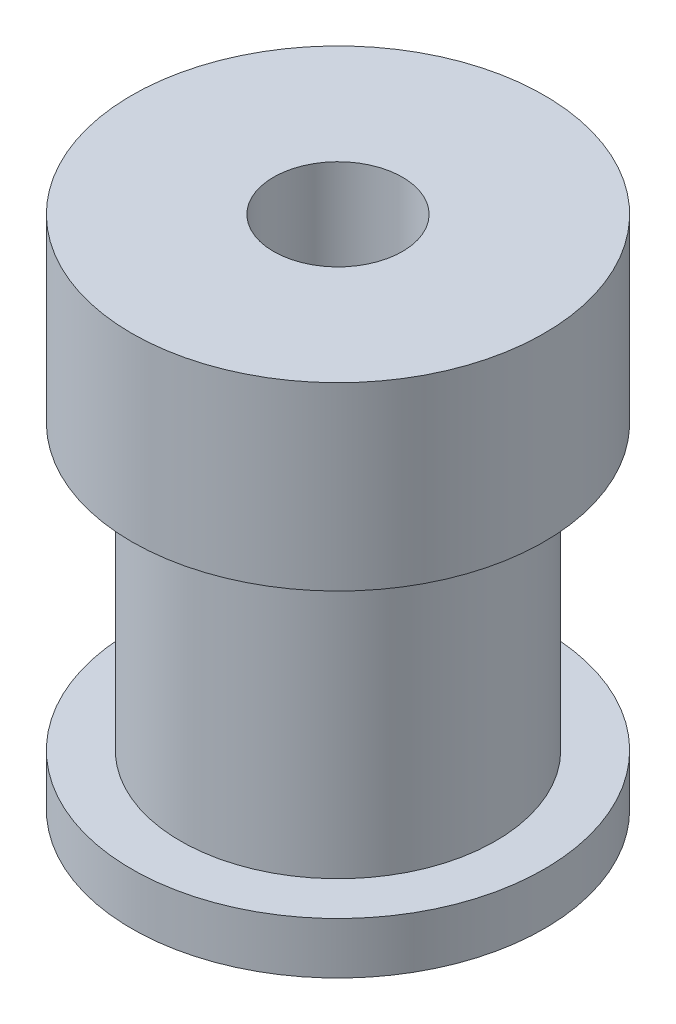
ISO-10303-21;
HEADER;
FILE_DESCRIPTION(('STEP AP214'),'2;1');
FILE_NAME('part.step','',(''),(''),'','','');
FILE_SCHEMA(('AUTOMOTIVE_DESIGN { 1 0 10303 214 1 1 1 1 }'));
ENDSEC;
DATA;
#1=APPLICATION_CONTEXT('core data for automotive mechanical design processes');
#2=APPLICATION_PROTOCOL_DEFINITION('international standard','automotive_design',2000,#1);
#3=PRODUCT_CONTEXT('',#1,'mechanical');
#4=PRODUCT('Part','Part','',(#3));
#5=PRODUCT_RELATED_PRODUCT_CATEGORY('part','',(#4));
#6=PRODUCT_DEFINITION_FORMATION('','',#4);
#7=PRODUCT_DEFINITION_CONTEXT('part definition',#1,'design');
#8=PRODUCT_DEFINITION('design','',#6,#7);
#9=PRODUCT_DEFINITION_SHAPE('','',#8);
#10=(LENGTH_UNIT() NAMED_UNIT(*) SI_UNIT(.MILLI.,.METRE.));
#11=(NAMED_UNIT(*) PLANE_ANGLE_UNIT() SI_UNIT($,.RADIAN.));
#12=(NAMED_UNIT(*) SI_UNIT($,.STERADIAN.) SOLID_ANGLE_UNIT());
#13=UNCERTAINTY_MEASURE_WITH_UNIT(LENGTH_MEASURE(1.E-05),#10,'distance_accuracy_value','');
#14=(GEOMETRIC_REPRESENTATION_CONTEXT(3) GLOBAL_UNCERTAINTY_ASSIGNED_CONTEXT((#13)) GLOBAL_UNIT_ASSIGNED_CONTEXT((#10,
#11,#12)) REPRESENTATION_CONTEXT('',''));
#15=CARTESIAN_POINT('',(0.,0.,0.));
#16=DIRECTION('',(0.,0.,1.));
#17=DIRECTION('',(1.,0.,0.));
#18=AXIS2_PLACEMENT_3D('',#15,#16,#17);
#19=CARTESIAN_POINT('',(0.,7.,0.));
#20=DIRECTION('',(0.,-1.,0.));
#21=DIRECTION('',(0.,0.,-1.));
#22=AXIS2_PLACEMENT_3D('',#19,#20,#21);
#23=CYLINDRICAL_SURFACE('',#22,8.);
#24=CARTESIAN_POINT('',(0.,7.,0.));
#25=DIRECTION('',(0.,1.,0.));
#26=DIRECTION('',(0.,0.,1.));
#27=AXIS2_PLACEMENT_3D('',#24,#25,#26);
#28=CIRCLE('',#27,8.);
#29=CARTESIAN_POINT('',(0.,7.,8.));
#30=VERTEX_POINT('',#29);
#31=EDGE_CURVE('E50',#30,#30,#28,.T.);
#32=ORIENTED_EDGE('',*,*,#31,.F.);
#33=EDGE_LOOP('',(#32));
#34=FACE_BOUND('',#33,.T.);
#35=CARTESIAN_POINT('',(0.,0.,0.));
#36=DIRECTION('',(0.,1.,0.));
#37=DIRECTION('',(0.,0.,1.));
#38=AXIS2_PLACEMENT_3D('',#35,#36,#37);
#39=CIRCLE('',#38,8.);
#40=CARTESIAN_POINT('',(0.,0.,8.));
#41=VERTEX_POINT('',#40);
#42=EDGE_CURVE('E55',#41,#41,#39,.T.);
#43=ORIENTED_EDGE('',*,*,#42,.T.);
#44=EDGE_LOOP('',(#43));
#45=FACE_BOUND('',#44,.T.);
#46=ADVANCED_FACE('F43',(#34,#45),#23,.T.);
#47=CARTESIAN_POINT('',(0.,7.,0.));
#48=DIRECTION('',(0.,1.,0.));
#49=DIRECTION('',(0.,0.,1.));
#50=AXIS2_PLACEMENT_3D('',#47,#48,#49);
#51=PLANE('',#50);
#52=CARTESIAN_POINT('',(0.,7.,0.));
#53=DIRECTION('',(0.,1.,0.));
#54=DIRECTION('',(0.,0.,1.));
#55=AXIS2_PLACEMENT_3D('',#52,#53,#54);
#56=CIRCLE('',#55,2.5);
#57=CARTESIAN_POINT('',(0.,7.,2.5));
#58=VERTEX_POINT('',#57);
#59=EDGE_CURVE('E74',#58,#58,#56,.T.);
#60=ORIENTED_EDGE('',*,*,#59,.F.);
#61=EDGE_LOOP('',(#60));
#62=FACE_BOUND('',#61,.T.);
#63=ORIENTED_EDGE('',*,*,#31,.T.);
#64=EDGE_LOOP('',(#63));
#65=FACE_BOUND('',#64,.T.);
#66=ADVANCED_FACE('F100',(#62,#65),#51,.T.);
#67=CARTESIAN_POINT('',(0.,0.,0.));
#68=DIRECTION('',(0.,1.,0.));
#69=DIRECTION('',(0.,0.,1.));
#70=AXIS2_PLACEMENT_3D('',#67,#68,#69);
#71=PLANE('',#70);
#72=CARTESIAN_POINT('',(0.,0.,0.));
#73=DIRECTION('',(0.,-1.,0.));
#74=DIRECTION('',(0.,0.,-1.));
#75=AXIS2_PLACEMENT_3D('',#72,#73,#74);
#76=CIRCLE('',#75,6.11);
#77=CARTESIAN_POINT('',(0.,0.,-6.11));
#78=VERTEX_POINT('',#77);
#79=EDGE_CURVE('E10',#78,#78,#76,.T.);
#80=ORIENTED_EDGE('',*,*,#79,.F.);
#81=EDGE_LOOP('',(#80));
#82=FACE_BOUND('',#81,.T.);
#83=ORIENTED_EDGE('',*,*,#42,.F.);
#84=EDGE_LOOP('',(#83));
#85=FACE_BOUND('',#84,.T.);
#86=ADVANCED_FACE('F105',(#82,#85),#71,.F.);
#87=CARTESIAN_POINT('',(0.,-11.,0.));
#88=DIRECTION('',(0.,1.,0.));
#89=DIRECTION('',(0.,0.,1.));
#90=AXIS2_PLACEMENT_3D('',#87,#88,#89);
#91=CYLINDRICAL_SURFACE('',#90,6.11);
#92=CARTESIAN_POINT('',(0.,-11.,0.));
#93=DIRECTION('',(0.,-1.,0.));
#94=DIRECTION('',(0.,0.,-1.));
#95=AXIS2_PLACEMENT_3D('',#92,#93,#94);
#96=CIRCLE('',#95,6.11);
#97=CARTESIAN_POINT('',(0.,-11.,-6.11));
#98=VERTEX_POINT('',#97);
#99=EDGE_CURVE('E58',#98,#98,#96,.T.);
#100=ORIENTED_EDGE('',*,*,#99,.F.);
#101=EDGE_LOOP('',(#100));
#102=FACE_BOUND('',#101,.T.);
#103=ORIENTED_EDGE('',*,*,#79,.T.);
#104=EDGE_LOOP('',(#103));
#105=FACE_BOUND('',#104,.T.);
#106=ADVANCED_FACE('F95',(#102,#105),#91,.T.);
#107=CARTESIAN_POINT('',(0.,-13.,0.));
#108=DIRECTION('',(0.,1.,0.));
#109=DIRECTION('',(0.,0.,1.));
#110=AXIS2_PLACEMENT_3D('',#107,#108,#109);
#111=CYLINDRICAL_SURFACE('',#110,8.);
#112=CARTESIAN_POINT('',(0.,-13.,0.));
#113=DIRECTION('',(0.,-1.,0.));
#114=DIRECTION('',(0.,0.,-1.));
#115=AXIS2_PLACEMENT_3D('',#112,#113,#114);
#116=CIRCLE('',#115,8.);
#117=CARTESIAN_POINT('',(0.,-13.,-8.));
#118=VERTEX_POINT('',#117);
#119=EDGE_CURVE('E64',#118,#118,#116,.T.);
#120=ORIENTED_EDGE('',*,*,#119,.F.);
#121=EDGE_LOOP('',(#120));
#122=FACE_BOUND('',#121,.T.);
#123=CARTESIAN_POINT('',(0.,-11.,0.));
#124=DIRECTION('',(0.,-1.,0.));
#125=DIRECTION('',(0.,0.,-1.));
#126=AXIS2_PLACEMENT_3D('',#123,#124,#125);
#127=CIRCLE('',#126,8.);
#128=CARTESIAN_POINT('',(0.,-11.,-8.));
#129=VERTEX_POINT('',#128);
#130=EDGE_CURVE('E68',#129,#129,#127,.T.);
#131=ORIENTED_EDGE('',*,*,#130,.T.);
#132=EDGE_LOOP('',(#131));
#133=FACE_BOUND('',#132,.T.);
#134=ADVANCED_FACE('F86',(#122,#133),#111,.T.);
#135=CARTESIAN_POINT('',(0.,-13.,0.));
#136=DIRECTION('',(0.,-1.,0.));
#137=DIRECTION('',(0.,0.,-1.));
#138=AXIS2_PLACEMENT_3D('',#135,#136,#137);
#139=PLANE('',#138);
#140=CARTESIAN_POINT('',(0.,-13.,0.));
#141=DIRECTION('',(0.,-1.,0.));
#142=DIRECTION('',(0.,0.,-1.));
#143=AXIS2_PLACEMENT_3D('',#140,#141,#142);
#144=CIRCLE('',#143,2.5);
#145=CARTESIAN_POINT('',(0.,-13.,-2.5));
#146=VERTEX_POINT('',#145);
#147=EDGE_CURVE('E46',#146,#146,#144,.T.);
#148=ORIENTED_EDGE('',*,*,#147,.F.);
#149=EDGE_LOOP('',(#148));
#150=FACE_BOUND('',#149,.T.);
#151=ORIENTED_EDGE('',*,*,#119,.T.);
#152=EDGE_LOOP('',(#151));
#153=FACE_BOUND('',#152,.T.);
#154=ADVANCED_FACE('F83',(#150,#153),#139,.T.);
#155=CARTESIAN_POINT('',(0.,-11.,0.));
#156=DIRECTION('',(0.,-1.,0.));
#157=DIRECTION('',(0.,0.,-1.));
#158=AXIS2_PLACEMENT_3D('',#155,#156,#157);
#159=PLANE('',#158);
#160=ORIENTED_EDGE('',*,*,#99,.T.);
#161=EDGE_LOOP('',(#160));
#162=FACE_BOUND('',#161,.T.);
#163=ORIENTED_EDGE('',*,*,#130,.F.);
#164=EDGE_LOOP('',(#163));
#165=FACE_BOUND('',#164,.T.);
#166=ADVANCED_FACE('F85',(#162,#165),#159,.F.);
#167=CARTESIAN_POINT('',(0.,-18.,0.));
#168=DIRECTION('',(0.,1.,0.));
#169=DIRECTION('',(0.,0.,1.));
#170=AXIS2_PLACEMENT_3D('',#167,#168,#169);
#171=CYLINDRICAL_SURFACE('',#170,2.5);
#172=ORIENTED_EDGE('',*,*,#147,.T.);
#173=EDGE_LOOP('',(#172));
#174=FACE_BOUND('',#173,.T.);
#175=ORIENTED_EDGE('',*,*,#59,.T.);
#176=EDGE_LOOP('',(#175));
#177=FACE_BOUND('',#176,.T.);
#178=ADVANCED_FACE('F81',(#174,#177),#171,.F.);
#179=CLOSED_SHELL('',(#46,#66,#86,#106,#134,#154,#166,#178));
#180=MANIFOLD_SOLID_BREP('B2',#179);
#181=ADVANCED_BREP_SHAPE_REPRESENTATION('',(#18,#180),#14);
#182=SHAPE_DEFINITION_REPRESENTATION(#9,#181);
ENDSEC;
END-ISO-10303-21;
